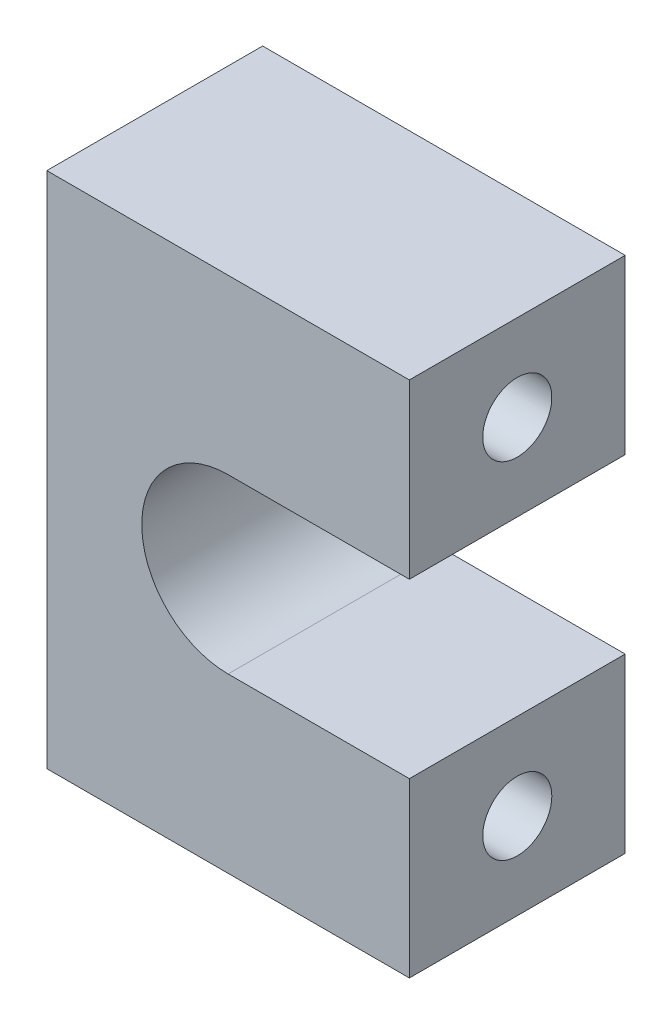
ISO-10303-21;
HEADER;
FILE_DESCRIPTION(('STEP AP214'),'2;1');
FILE_NAME('part.step','',(''),(''),'','','');
FILE_SCHEMA(('AUTOMOTIVE_DESIGN { 1 0 10303 214 1 1 1 1 }'));
ENDSEC;
DATA;
#1=APPLICATION_CONTEXT('core data for automotive mechanical design processes');
#2=APPLICATION_PROTOCOL_DEFINITION('international standard','automotive_design',2000,#1);
#3=PRODUCT_CONTEXT('',#1,'mechanical');
#4=PRODUCT('Part','Part','',(#3));
#5=PRODUCT_RELATED_PRODUCT_CATEGORY('part','',(#4));
#6=PRODUCT_DEFINITION_FORMATION('','',#4);
#7=PRODUCT_DEFINITION_CONTEXT('part definition',#1,'design');
#8=PRODUCT_DEFINITION('design','',#6,#7);
#9=PRODUCT_DEFINITION_SHAPE('','',#8);
#10=(LENGTH_UNIT() NAMED_UNIT(*) SI_UNIT(.MILLI.,.METRE.));
#11=(NAMED_UNIT(*) PLANE_ANGLE_UNIT() SI_UNIT($,.RADIAN.));
#12=(NAMED_UNIT(*) SI_UNIT($,.STERADIAN.) SOLID_ANGLE_UNIT());
#13=UNCERTAINTY_MEASURE_WITH_UNIT(LENGTH_MEASURE(1.E-05),#10,'distance_accuracy_value','');
#14=(GEOMETRIC_REPRESENTATION_CONTEXT(3) GLOBAL_UNCERTAINTY_ASSIGNED_CONTEXT((#13)) GLOBAL_UNIT_ASSIGNED_CONTEXT((#10,
#11,#12)) REPRESENTATION_CONTEXT('',''));
#15=CARTESIAN_POINT('',(0.,0.,0.));
#16=DIRECTION('',(0.,0.,1.));
#17=DIRECTION('',(1.,0.,0.));
#18=AXIS2_PLACEMENT_3D('',#15,#16,#17);
#19=CARTESIAN_POINT('',(42.,60.,0.));
#20=DIRECTION('',(-1.,0.,0.));
#21=DIRECTION('',(0.,0.,1.));
#22=AXIS2_PLACEMENT_3D('',#19,#20,#21);
#23=PLANE('',#22);
#24=CARTESIAN_POINT('',(42.,10.,-12.5));
#25=DIRECTION('',(1.,0.,0.));
#26=DIRECTION('',(0.,0.,-1.));
#27=AXIS2_PLACEMENT_3D('',#24,#25,#26);
#28=CIRCLE('',#27,4.);
#29=CARTESIAN_POINT('',(42.,10.,-16.5));
#30=VERTEX_POINT('',#29);
#31=EDGE_CURVE('E206',#30,#30,#28,.T.);
#32=ORIENTED_EDGE('',*,*,#31,.F.);
#33=EDGE_LOOP('',(#32));
#34=FACE_BOUND('',#33,.T.);
#35=DIRECTION('',(0.,-1.,0.));
#36=VECTOR('',#35,1.);
#37=CARTESIAN_POINT('',(42.,60.,-25.));
#38=LINE('',#37,#36);
#39=CARTESIAN_POINT('',(42.,20.,-25.));
#40=VERTEX_POINT('',#39);
#41=CARTESIAN_POINT('',(42.,0.,-25.));
#42=VERTEX_POINT('',#41);
#43=EDGE_CURVE('E168',#40,#42,#38,.T.);
#44=ORIENTED_EDGE('',*,*,#43,.F.);
#45=DIRECTION('',(0.,0.,1.));
#46=VECTOR('',#45,1.);
#47=CARTESIAN_POINT('',(42.,20.,-56.));
#48=LINE('',#47,#46);
#49=CARTESIAN_POINT('',(42.,20.,0.));
#50=VERTEX_POINT('',#49);
#51=EDGE_CURVE('E146',#40,#50,#48,.T.);
#52=ORIENTED_EDGE('',*,*,#51,.T.);
#53=DIRECTION('',(0.,-1.,0.));
#54=VECTOR('',#53,1.);
#55=CARTESIAN_POINT('',(42.,60.,0.));
#56=LINE('',#55,#54);
#57=CARTESIAN_POINT('',(42.,0.,0.));
#58=VERTEX_POINT('',#57);
#59=EDGE_CURVE('E131',#50,#58,#56,.T.);
#60=ORIENTED_EDGE('',*,*,#59,.T.);
#61=DIRECTION('',(0.,0.,-1.));
#62=VECTOR('',#61,1.);
#63=CARTESIAN_POINT('',(42.,0.,0.));
#64=LINE('',#63,#62);
#65=EDGE_CURVE('E165',#58,#42,#64,.T.);
#66=ORIENTED_EDGE('',*,*,#65,.T.);
#67=EDGE_LOOP('',(#44,#52,#60,#66));
#68=FACE_BOUND('',#67,.T.);
#69=ADVANCED_FACE('F34',(#34,#68),#23,.F.);
#70=CARTESIAN_POINT('',(0.,60.,0.));
#71=DIRECTION('',(1.,0.,0.));
#72=DIRECTION('',(0.,0.,-1.));
#73=AXIS2_PLACEMENT_3D('',#70,#71,#72);
#74=PLANE('',#73);
#75=DIRECTION('',(0.,0.,1.));
#76=VECTOR('',#75,1.);
#77=CARTESIAN_POINT('',(0.,0.,0.));
#78=LINE('',#77,#76);
#79=CARTESIAN_POINT('',(0.,0.,-25.));
#80=VERTEX_POINT('',#79);
#81=CARTESIAN_POINT('',(0.,0.,0.));
#82=VERTEX_POINT('',#81);
#83=EDGE_CURVE('E149',#80,#82,#78,.T.);
#84=ORIENTED_EDGE('',*,*,#83,.T.);
#85=DIRECTION('',(0.,-1.,0.));
#86=VECTOR('',#85,1.);
#87=CARTESIAN_POINT('',(0.,60.,0.));
#88=LINE('',#87,#86);
#89=CARTESIAN_POINT('',(0.,60.,0.));
#90=VERTEX_POINT('',#89);
#91=EDGE_CURVE('E130',#90,#82,#88,.T.);
#92=ORIENTED_EDGE('',*,*,#91,.F.);
#93=DIRECTION('',(0.,0.,1.));
#94=VECTOR('',#93,1.);
#95=CARTESIAN_POINT('',(0.,60.,0.));
#96=LINE('',#95,#94);
#97=CARTESIAN_POINT('',(0.,60.,-25.));
#98=VERTEX_POINT('',#97);
#99=EDGE_CURVE('E154',#98,#90,#96,.T.);
#100=ORIENTED_EDGE('',*,*,#99,.F.);
#101=DIRECTION('',(0.,-1.,0.));
#102=VECTOR('',#101,1.);
#103=CARTESIAN_POINT('',(0.,60.,-25.));
#104=LINE('',#103,#102);
#105=EDGE_CURVE('E159',#98,#80,#104,.T.);
#106=ORIENTED_EDGE('',*,*,#105,.T.);
#107=EDGE_LOOP('',(#84,#92,#100,#106));
#108=FACE_BOUND('',#107,.T.);
#109=ADVANCED_FACE('F36',(#108),#74,.F.);
#110=CARTESIAN_POINT('',(0.,60.,0.));
#111=DIRECTION('',(0.,0.,-1.));
#112=DIRECTION('',(-1.,0.,0.));
#113=AXIS2_PLACEMENT_3D('',#110,#111,#112);
#114=PLANE('',#113);
#115=ORIENTED_EDGE('',*,*,#59,.F.);
#116=DIRECTION('',(1.,0.,0.));
#117=VECTOR('',#116,1.);
#118=CARTESIAN_POINT('',(42.,20.,0.));
#119=LINE('',#118,#117);
#120=CARTESIAN_POINT('',(21.,20.,0.));
#121=VERTEX_POINT('',#120);
#122=EDGE_CURVE('E117',#121,#50,#119,.T.);
#123=ORIENTED_EDGE('',*,*,#122,.F.);
#124=CARTESIAN_POINT('',(21.,30.,0.));
#125=DIRECTION('',(0.,0.,1.));
#126=DIRECTION('',(-1.,0.,0.));
#127=AXIS2_PLACEMENT_3D('',#124,#125,#126);
#128=CIRCLE('',#127,10.);
#129=CARTESIAN_POINT('',(21.,40.,0.));
#130=VERTEX_POINT('',#129);
#131=EDGE_CURVE('E125',#130,#121,#128,.T.);
#132=ORIENTED_EDGE('',*,*,#131,.F.);
#133=DIRECTION('',(-1.,0.,0.));
#134=VECTOR('',#133,1.);
#135=CARTESIAN_POINT('',(42.,40.,0.));
#136=LINE('',#135,#134);
#137=CARTESIAN_POINT('',(42.,40.,0.));
#138=VERTEX_POINT('',#137);
#139=EDGE_CURVE('E109',#138,#130,#136,.T.);
#140=ORIENTED_EDGE('',*,*,#139,.F.);
#141=CARTESIAN_POINT('',(42.,60.,0.));
#142=VERTEX_POINT('',#141);
#143=EDGE_CURVE('E121',#142,#138,#56,.T.);
#144=ORIENTED_EDGE('',*,*,#143,.F.);
#145=DIRECTION('',(1.,0.,0.));
#146=VECTOR('',#145,1.);
#147=CARTESIAN_POINT('',(0.,60.,0.));
#148=LINE('',#147,#146);
#149=EDGE_CURVE('E86',#90,#142,#148,.T.);
#150=ORIENTED_EDGE('',*,*,#149,.F.);
#151=ORIENTED_EDGE('',*,*,#91,.T.);
#152=DIRECTION('',(1.,0.,0.));
#153=VECTOR('',#152,1.);
#154=CARTESIAN_POINT('',(0.,0.,0.));
#155=LINE('',#154,#153);
#156=EDGE_CURVE('E162',#82,#58,#155,.T.);
#157=ORIENTED_EDGE('',*,*,#156,.T.);
#158=EDGE_LOOP('',(#115,#123,#132,#140,#144,#150,#151,#157));
#159=FACE_BOUND('',#158,.T.);
#160=ADVANCED_FACE('F120',(#159),#114,.F.);
#161=CARTESIAN_POINT('',(42.,50.,-12.5));
#162=DIRECTION('',(1.,0.,0.));
#163=DIRECTION('',(0.,0.,1.));
#164=AXIS2_PLACEMENT_3D('',#161,#162,#163);
#165=CIRCLE('',#164,4.);
#166=CARTESIAN_POINT('',(42.,50.,-8.5));
#167=VERTEX_POINT('',#166);
#168=EDGE_CURVE('E201',#167,#167,#165,.T.);
#169=ORIENTED_EDGE('',*,*,#168,.F.);
#170=EDGE_LOOP('',(#169));
#171=FACE_BOUND('',#170,.T.);
#172=ORIENTED_EDGE('',*,*,#143,.T.);
#173=DIRECTION('',(0.,0.,1.));
#174=VECTOR('',#173,1.);
#175=CARTESIAN_POINT('',(42.,40.,-56.));
#176=LINE('',#175,#174);
#177=CARTESIAN_POINT('',(42.,40.,-25.));
#178=VERTEX_POINT('',#177);
#179=EDGE_CURVE('E106',#178,#138,#176,.T.);
#180=ORIENTED_EDGE('',*,*,#179,.F.);
#181=CARTESIAN_POINT('',(42.,60.,-25.));
#182=VERTEX_POINT('',#181);
#183=EDGE_CURVE('E134',#182,#178,#38,.T.);
#184=ORIENTED_EDGE('',*,*,#183,.F.);
#185=DIRECTION('',(0.,0.,-1.));
#186=VECTOR('',#185,1.);
#187=CARTESIAN_POINT('',(42.,60.,0.));
#188=LINE('',#187,#186);
#189=EDGE_CURVE('E129',#142,#182,#188,.T.);
#190=ORIENTED_EDGE('',*,*,#189,.F.);
#191=EDGE_LOOP('',(#172,#180,#184,#190));
#192=FACE_BOUND('',#191,.T.);
#193=ADVANCED_FACE('F128',(#171,#192),#23,.F.);
#194=CARTESIAN_POINT('',(0.,60.,-25.));
#195=DIRECTION('',(0.,0.,1.));
#196=DIRECTION('',(1.,0.,0.));
#197=AXIS2_PLACEMENT_3D('',#194,#195,#196);
#198=PLANE('',#197);
#199=CARTESIAN_POINT('',(21.,30.,-25.));
#200=DIRECTION('',(0.,0.,1.));
#201=DIRECTION('',(1.,0.,0.));
#202=AXIS2_PLACEMENT_3D('',#199,#200,#201);
#203=CIRCLE('',#202,10.);
#204=CARTESIAN_POINT('',(21.,40.,-25.));
#205=VERTEX_POINT('',#204);
#206=CARTESIAN_POINT('',(21.,20.,-25.));
#207=VERTEX_POINT('',#206);
#208=EDGE_CURVE('E42',#205,#207,#203,.T.);
#209=ORIENTED_EDGE('',*,*,#208,.T.);
#210=DIRECTION('',(1.,0.,0.));
#211=VECTOR('',#210,1.);
#212=CARTESIAN_POINT('',(0.,20.,-25.));
#213=LINE('',#212,#211);
#214=EDGE_CURVE('E11',#207,#40,#213,.T.);
#215=ORIENTED_EDGE('',*,*,#214,.T.);
#216=ORIENTED_EDGE('',*,*,#43,.T.);
#217=DIRECTION('',(-1.,0.,0.));
#218=VECTOR('',#217,1.);
#219=CARTESIAN_POINT('',(0.,0.,-25.));
#220=LINE('',#219,#218);
#221=EDGE_CURVE('E78',#42,#80,#220,.T.);
#222=ORIENTED_EDGE('',*,*,#221,.T.);
#223=ORIENTED_EDGE('',*,*,#105,.F.);
#224=DIRECTION('',(-1.,0.,0.));
#225=VECTOR('',#224,1.);
#226=CARTESIAN_POINT('',(0.,60.,-25.));
#227=LINE('',#226,#225);
#228=EDGE_CURVE('E58',#182,#98,#227,.T.);
#229=ORIENTED_EDGE('',*,*,#228,.F.);
#230=ORIENTED_EDGE('',*,*,#183,.T.);
#231=DIRECTION('',(-1.,0.,0.));
#232=VECTOR('',#231,1.);
#233=CARTESIAN_POINT('',(0.,40.,-25.));
#234=LINE('',#233,#232);
#235=EDGE_CURVE('E112',#178,#205,#234,.T.);
#236=ORIENTED_EDGE('',*,*,#235,.T.);
#237=EDGE_LOOP('',(#209,#215,#216,#222,#223,#229,#230,#236));
#238=FACE_BOUND('',#237,.T.);
#239=ADVANCED_FACE('F139',(#238),#198,.F.);
#240=CARTESIAN_POINT('',(0.,60.,0.));
#241=DIRECTION('',(0.,-1.,0.));
#242=DIRECTION('',(0.,0.,-1.));
#243=AXIS2_PLACEMENT_3D('',#240,#241,#242);
#244=PLANE('',#243);
#245=ORIENTED_EDGE('',*,*,#99,.T.);
#246=ORIENTED_EDGE('',*,*,#149,.T.);
#247=ORIENTED_EDGE('',*,*,#189,.T.);
#248=ORIENTED_EDGE('',*,*,#228,.T.);
#249=EDGE_LOOP('',(#245,#246,#247,#248));
#250=FACE_BOUND('',#249,.T.);
#251=ADVANCED_FACE('F173',(#250),#244,.F.);
#252=CARTESIAN_POINT('',(0.,0.,0.));
#253=DIRECTION('',(0.,-1.,0.));
#254=DIRECTION('',(0.,0.,-1.));
#255=AXIS2_PLACEMENT_3D('',#252,#253,#254);
#256=PLANE('',#255);
#257=ORIENTED_EDGE('',*,*,#83,.F.);
#258=ORIENTED_EDGE('',*,*,#221,.F.);
#259=ORIENTED_EDGE('',*,*,#65,.F.);
#260=ORIENTED_EDGE('',*,*,#156,.F.);
#261=EDGE_LOOP('',(#257,#258,#259,#260));
#262=FACE_BOUND('',#261,.T.);
#263=ADVANCED_FACE('F175',(#262),#256,.T.);
#264=CARTESIAN_POINT('',(42.,20.,-56.));
#265=DIRECTION('',(0.,-1.,0.));
#266=DIRECTION('',(1.,0.,0.));
#267=AXIS2_PLACEMENT_3D('',#264,#265,#266);
#268=PLANE('',#267);
#269=DIRECTION('',(0.,0.,1.));
#270=VECTOR('',#269,1.);
#271=CARTESIAN_POINT('',(21.,20.,-56.));
#272=LINE('',#271,#270);
#273=EDGE_CURVE('E144',#207,#121,#272,.T.);
#274=ORIENTED_EDGE('',*,*,#273,.T.);
#275=ORIENTED_EDGE('',*,*,#122,.T.);
#276=ORIENTED_EDGE('',*,*,#51,.F.);
#277=ORIENTED_EDGE('',*,*,#214,.F.);
#278=EDGE_LOOP('',(#274,#275,#276,#277));
#279=FACE_BOUND('',#278,.T.);
#280=ADVANCED_FACE('F181',(#279),#268,.F.);
#281=CARTESIAN_POINT('',(21.,30.,-56.));
#282=DIRECTION('',(0.,0.,1.));
#283=DIRECTION('',(1.,0.,0.));
#284=AXIS2_PLACEMENT_3D('',#281,#282,#283);
#285=CYLINDRICAL_SURFACE('',#284,10.);
#286=DIRECTION('',(0.,0.,1.));
#287=VECTOR('',#286,1.);
#288=CARTESIAN_POINT('',(21.,40.,-56.));
#289=LINE('',#288,#287);
#290=EDGE_CURVE('E49',#205,#130,#289,.T.);
#291=ORIENTED_EDGE('',*,*,#290,.T.);
#292=ORIENTED_EDGE('',*,*,#131,.T.);
#293=ORIENTED_EDGE('',*,*,#273,.F.);
#294=ORIENTED_EDGE('',*,*,#208,.F.);
#295=EDGE_LOOP('',(#291,#292,#293,#294));
#296=FACE_BOUND('',#295,.T.);
#297=ADVANCED_FACE('F143',(#296),#285,.F.);
#298=CARTESIAN_POINT('',(42.,40.,-56.));
#299=DIRECTION('',(0.,1.,0.));
#300=DIRECTION('',(0.,0.,1.));
#301=AXIS2_PLACEMENT_3D('',#298,#299,#300);
#302=PLANE('',#301);
#303=ORIENTED_EDGE('',*,*,#179,.T.);
#304=ORIENTED_EDGE('',*,*,#139,.T.);
#305=ORIENTED_EDGE('',*,*,#290,.F.);
#306=ORIENTED_EDGE('',*,*,#235,.F.);
#307=EDGE_LOOP('',(#303,#304,#305,#306));
#308=FACE_BOUND('',#307,.T.);
#309=ADVANCED_FACE('F108',(#308),#302,.F.);
#310=CARTESIAN_POINT('',(27.,50.,-12.5));
#311=DIRECTION('',(1.,0.,0.));
#312=DIRECTION('',(0.,0.,-1.));
#313=AXIS2_PLACEMENT_3D('',#310,#311,#312);
#314=CYLINDRICAL_SURFACE('',#313,4.);
#315=CARTESIAN_POINT('',(27.,50.,-12.5));
#316=DIRECTION('',(1.,0.,0.));
#317=DIRECTION('',(0.,0.,1.));
#318=AXIS2_PLACEMENT_3D('',#315,#316,#317);
#319=CIRCLE('',#318,4.);
#320=CARTESIAN_POINT('',(27.,50.,-8.5));
#321=VERTEX_POINT('',#320);
#322=EDGE_CURVE('E203',#321,#321,#319,.T.);
#323=ORIENTED_EDGE('',*,*,#322,.F.);
#324=EDGE_LOOP('',(#323));
#325=FACE_BOUND('',#324,.T.);
#326=ORIENTED_EDGE('',*,*,#168,.T.);
#327=EDGE_LOOP('',(#326));
#328=FACE_BOUND('',#327,.T.);
#329=ADVANCED_FACE('F218',(#325,#328),#314,.F.);
#330=CARTESIAN_POINT('',(27.,50.,-12.5));
#331=DIRECTION('',(-1.,0.,0.));
#332=DIRECTION('',(0.,0.,1.));
#333=AXIS2_PLACEMENT_3D('',#330,#331,#332);
#334=PLANE('',#333);
#335=ORIENTED_EDGE('',*,*,#322,.T.);
#336=EDGE_LOOP('',(#335));
#337=FACE_BOUND('',#336,.T.);
#338=ADVANCED_FACE('F224',(#337),#334,.F.);
#339=CARTESIAN_POINT('',(27.,10.,-12.5));
#340=DIRECTION('',(1.,0.,0.));
#341=DIRECTION('',(0.,0.,-1.));
#342=AXIS2_PLACEMENT_3D('',#339,#340,#341);
#343=CYLINDRICAL_SURFACE('',#342,4.);
#344=CARTESIAN_POINT('',(27.,10.,-12.5));
#345=DIRECTION('',(1.,0.,0.));
#346=DIRECTION('',(0.,0.,-1.));
#347=AXIS2_PLACEMENT_3D('',#344,#345,#346);
#348=CIRCLE('',#347,4.);
#349=CARTESIAN_POINT('',(27.,10.,-16.5));
#350=VERTEX_POINT('',#349);
#351=EDGE_CURVE('E126',#350,#350,#348,.T.);
#352=ORIENTED_EDGE('',*,*,#351,.F.);
#353=EDGE_LOOP('',(#352));
#354=FACE_BOUND('',#353,.T.);
#355=ORIENTED_EDGE('',*,*,#31,.T.);
#356=EDGE_LOOP('',(#355));
#357=FACE_BOUND('',#356,.T.);
#358=ADVANCED_FACE('F229',(#354,#357),#343,.F.);
#359=CARTESIAN_POINT('',(27.,10.,-12.5));
#360=DIRECTION('',(1.,0.,0.));
#361=DIRECTION('',(0.,0.,-1.));
#362=AXIS2_PLACEMENT_3D('',#359,#360,#361);
#363=PLANE('',#362);
#364=ORIENTED_EDGE('',*,*,#351,.T.);
#365=EDGE_LOOP('',(#364));
#366=FACE_BOUND('',#365,.T.);
#367=ADVANCED_FACE('F235',(#366),#363,.T.);
#368=CLOSED_SHELL('',(#69,#109,#160,#193,#239,#251,#263,#280,#297,#309,#329,#338,#358,#367));
#369=MANIFOLD_SOLID_BREP('B2',#368);
#370=ADVANCED_BREP_SHAPE_REPRESENTATION('',(#18,#369),#14);
#371=SHAPE_DEFINITION_REPRESENTATION(#9,#370);
ENDSEC;
END-ISO-10303-21;
